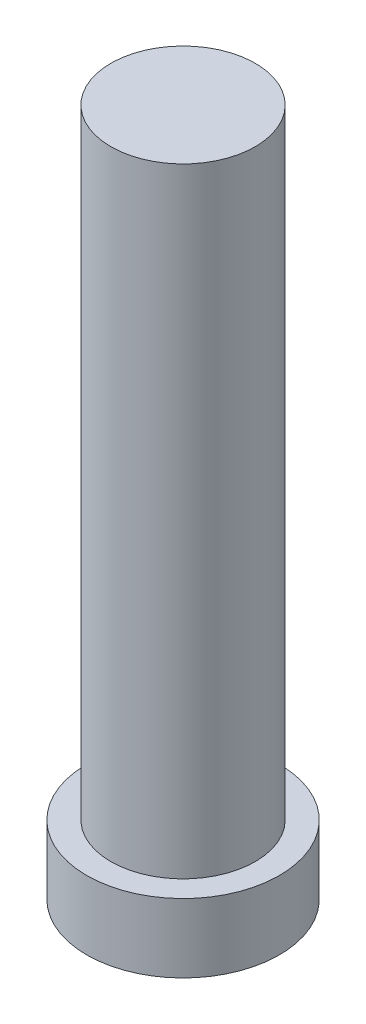
ISO-10303-21;
HEADER;
FILE_DESCRIPTION(('STEP AP214'),'2;1');
FILE_NAME('part.step','',(''),(''),'','','');
FILE_SCHEMA(('AUTOMOTIVE_DESIGN { 1 0 10303 214 1 1 1 1 }'));
ENDSEC;
DATA;
#1=APPLICATION_CONTEXT('core data for automotive mechanical design processes');
#2=APPLICATION_PROTOCOL_DEFINITION('international standard','automotive_design',2000,#1);
#3=PRODUCT_CONTEXT('',#1,'mechanical');
#4=PRODUCT('Part','Part','',(#3));
#5=PRODUCT_RELATED_PRODUCT_CATEGORY('part','',(#4));
#6=PRODUCT_DEFINITION_FORMATION('','',#4);
#7=PRODUCT_DEFINITION_CONTEXT('part definition',#1,'design');
#8=PRODUCT_DEFINITION('design','',#6,#7);
#9=PRODUCT_DEFINITION_SHAPE('','',#8);
#10=(LENGTH_UNIT() NAMED_UNIT(*) SI_UNIT(.MILLI.,.METRE.));
#11=(NAMED_UNIT(*) PLANE_ANGLE_UNIT() SI_UNIT($,.RADIAN.));
#12=(NAMED_UNIT(*) SI_UNIT($,.STERADIAN.) SOLID_ANGLE_UNIT());
#13=UNCERTAINTY_MEASURE_WITH_UNIT(LENGTH_MEASURE(1.E-05),#10,'distance_accuracy_value','');
#14=(GEOMETRIC_REPRESENTATION_CONTEXT(3) GLOBAL_UNCERTAINTY_ASSIGNED_CONTEXT((#13)) GLOBAL_UNIT_ASSIGNED_CONTEXT((#10,
#11,#12)) REPRESENTATION_CONTEXT('',''));
#15=CARTESIAN_POINT('',(0.,0.,0.));
#16=DIRECTION('',(0.,0.,1.));
#17=DIRECTION('',(1.,0.,0.));
#18=AXIS2_PLACEMENT_3D('',#15,#16,#17);
#19=CARTESIAN_POINT('',(0.,1.27,0.));
#20=DIRECTION('',(0.,-1.,0.));
#21=DIRECTION('',(0.,0.,-1.));
#22=AXIS2_PLACEMENT_3D('',#19,#20,#21);
#23=CYLINDRICAL_SURFACE('',#22,1.778);
#24=CARTESIAN_POINT('',(0.,1.27,0.));
#25=DIRECTION('',(0.,1.,0.));
#26=DIRECTION('',(0.,0.,1.));
#27=AXIS2_PLACEMENT_3D('',#24,#25,#26);
#28=CIRCLE('',#27,1.778);
#29=CARTESIAN_POINT('',(0.,1.27,1.778));
#30=VERTEX_POINT('',#29);
#31=EDGE_CURVE('E10',#30,#30,#28,.T.);
#32=ORIENTED_EDGE('',*,*,#31,.F.);
#33=EDGE_LOOP('',(#32));
#34=FACE_BOUND('',#33,.T.);
#35=CARTESIAN_POINT('',(0.,0.,0.));
#36=DIRECTION('',(0.,1.,0.));
#37=DIRECTION('',(0.,0.,1.));
#38=AXIS2_PLACEMENT_3D('',#35,#36,#37);
#39=CIRCLE('',#38,1.778);
#40=CARTESIAN_POINT('',(0.,0.,1.778));
#41=VERTEX_POINT('',#40);
#42=EDGE_CURVE('E34',#41,#41,#39,.T.);
#43=ORIENTED_EDGE('',*,*,#42,.T.);
#44=EDGE_LOOP('',(#43));
#45=FACE_BOUND('',#44,.T.);
#46=ADVANCED_FACE('F31',(#34,#45),#23,.T.);
#47=CARTESIAN_POINT('',(0.,1.27,0.));
#48=DIRECTION('',(0.,1.,0.));
#49=DIRECTION('',(0.,0.,1.));
#50=AXIS2_PLACEMENT_3D('',#47,#48,#49);
#51=PLANE('',#50);
#52=CARTESIAN_POINT('',(0.,1.27,0.));
#53=DIRECTION('',(0.,1.,0.));
#54=DIRECTION('',(0.,0.,1.));
#55=AXIS2_PLACEMENT_3D('',#52,#53,#54);
#56=CIRCLE('',#55,1.3335);
#57=CARTESIAN_POINT('',(0.,1.27,1.3335));
#58=VERTEX_POINT('',#57);
#59=EDGE_CURVE('E43',#58,#58,#56,.T.);
#60=ORIENTED_EDGE('',*,*,#59,.F.);
#61=EDGE_LOOP('',(#60));
#62=FACE_BOUND('',#61,.T.);
#63=ORIENTED_EDGE('',*,*,#31,.T.);
#64=EDGE_LOOP('',(#63));
#65=FACE_BOUND('',#64,.T.);
#66=ADVANCED_FACE('F58',(#62,#65),#51,.T.);
#67=CARTESIAN_POINT('',(0.,0.,0.));
#68=DIRECTION('',(0.,1.,0.));
#69=DIRECTION('',(0.,0.,1.));
#70=AXIS2_PLACEMENT_3D('',#67,#68,#69);
#71=PLANE('',#70);
#72=ORIENTED_EDGE('',*,*,#42,.F.);
#73=EDGE_LOOP('',(#72));
#74=FACE_BOUND('',#73,.T.);
#75=ADVANCED_FACE('F54',(#74),#71,.F.);
#76=CARTESIAN_POINT('',(0.,12.7,0.));
#77=DIRECTION('',(0.,-1.,0.));
#78=DIRECTION('',(0.,0.,-1.));
#79=AXIS2_PLACEMENT_3D('',#76,#77,#78);
#80=CYLINDRICAL_SURFACE('',#79,1.3335);
#81=CARTESIAN_POINT('',(0.,12.7,0.));
#82=DIRECTION('',(0.,1.,0.));
#83=DIRECTION('',(0.,0.,1.));
#84=AXIS2_PLACEMENT_3D('',#81,#82,#83);
#85=CIRCLE('',#84,1.3335);
#86=CARTESIAN_POINT('',(0.,12.7,1.3335));
#87=VERTEX_POINT('',#86);
#88=EDGE_CURVE('E41',#87,#87,#85,.T.);
#89=ORIENTED_EDGE('',*,*,#88,.F.);
#90=EDGE_LOOP('',(#89));
#91=FACE_BOUND('',#90,.T.);
#92=ORIENTED_EDGE('',*,*,#59,.T.);
#93=EDGE_LOOP('',(#92));
#94=FACE_BOUND('',#93,.T.);
#95=ADVANCED_FACE('F51',(#91,#94),#80,.T.);
#96=CARTESIAN_POINT('',(0.,12.7,0.));
#97=DIRECTION('',(0.,1.,0.));
#98=DIRECTION('',(0.,0.,1.));
#99=AXIS2_PLACEMENT_3D('',#96,#97,#98);
#100=PLANE('',#99);
#101=ORIENTED_EDGE('',*,*,#88,.T.);
#102=EDGE_LOOP('',(#101));
#103=FACE_BOUND('',#102,.T.);
#104=ADVANCED_FACE('F49',(#103),#100,.T.);
#105=CLOSED_SHELL('',(#46,#66,#75,#95,#104));
#106=MANIFOLD_SOLID_BREP('B2',#105);
#107=ADVANCED_BREP_SHAPE_REPRESENTATION('',(#18,#106),#14);
#108=SHAPE_DEFINITION_REPRESENTATION(#9,#107);
ENDSEC;
END-ISO-10303-21;
